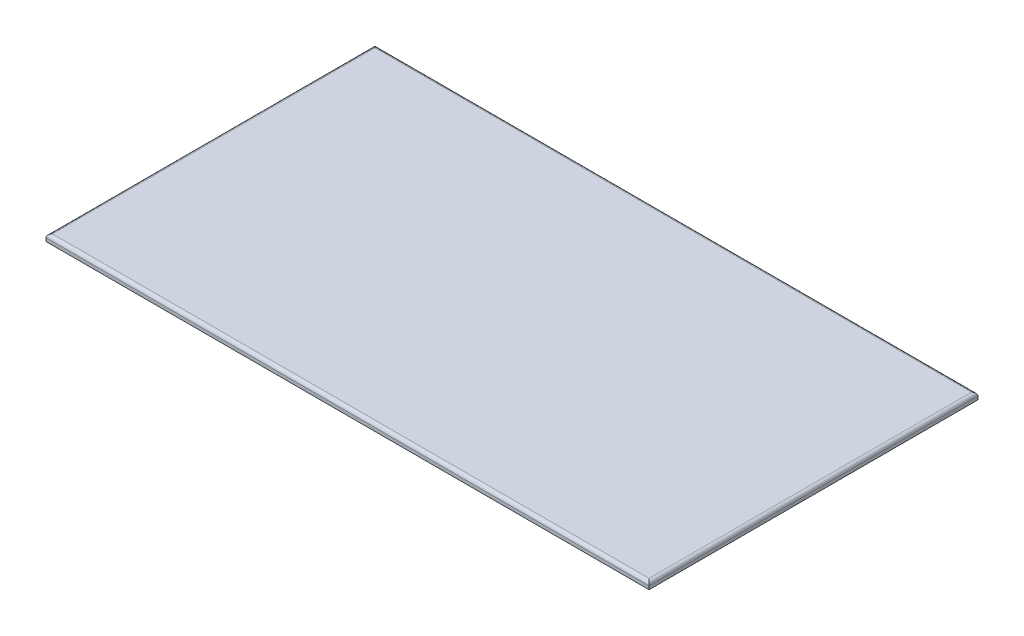
ISO-10303-21;
HEADER;
FILE_DESCRIPTION(('STEP AP214'),'2;1');
FILE_NAME('part.step','',(''),(''),'','','');
FILE_SCHEMA(('AUTOMOTIVE_DESIGN { 1 0 10303 214 1 1 1 1 }'));
ENDSEC;
DATA;
#1=APPLICATION_CONTEXT('core data for automotive mechanical design processes');
#2=APPLICATION_PROTOCOL_DEFINITION('international standard','automotive_design',2000,#1);
#3=PRODUCT_CONTEXT('',#1,'mechanical');
#4=PRODUCT('Part','Part','',(#3));
#5=PRODUCT_RELATED_PRODUCT_CATEGORY('part','',(#4));
#6=PRODUCT_DEFINITION_FORMATION('','',#4);
#7=PRODUCT_DEFINITION_CONTEXT('part definition',#1,'design');
#8=PRODUCT_DEFINITION('design','',#6,#7);
#9=PRODUCT_DEFINITION_SHAPE('','',#8);
#10=(LENGTH_UNIT() NAMED_UNIT(*) SI_UNIT(.MILLI.,.METRE.));
#11=(NAMED_UNIT(*) PLANE_ANGLE_UNIT() SI_UNIT($,.RADIAN.));
#12=(NAMED_UNIT(*) SI_UNIT($,.STERADIAN.) SOLID_ANGLE_UNIT());
#13=UNCERTAINTY_MEASURE_WITH_UNIT(LENGTH_MEASURE(1.E-05),#10,'distance_accuracy_value','');
#14=(GEOMETRIC_REPRESENTATION_CONTEXT(3) GLOBAL_UNCERTAINTY_ASSIGNED_CONTEXT((#13)) GLOBAL_UNIT_ASSIGNED_CONTEXT((#10,
#11,#12)) REPRESENTATION_CONTEXT('',''));
#15=CARTESIAN_POINT('',(0.,0.,0.));
#16=DIRECTION('',(0.,0.,1.));
#17=DIRECTION('',(1.,0.,0.));
#18=AXIS2_PLACEMENT_3D('',#15,#16,#17);
#19=CARTESIAN_POINT('',(0.,0.,0.));
#20=DIRECTION('',(0.,-1.,0.));
#21=DIRECTION('',(0.,0.,-1.));
#22=AXIS2_PLACEMENT_3D('',#19,#20,#21);
#23=PLANE('',#22);
#24=DIRECTION('',(0.,0.,1.));
#25=VECTOR('',#24,1.);
#26=CARTESIAN_POINT('',(0.,0.,0.));
#27=LINE('',#26,#25);
#28=CARTESIAN_POINT('',(0.,0.,-300.));
#29=VERTEX_POINT('',#28);
#30=CARTESIAN_POINT('',(0.,0.,0.));
#31=VERTEX_POINT('',#30);
#32=EDGE_CURVE('E175',#29,#31,#27,.T.);
#33=ORIENTED_EDGE('',*,*,#32,.F.);
#34=DIRECTION('',(-1.,0.,0.));
#35=VECTOR('',#34,1.);
#36=CARTESIAN_POINT('',(0.,0.,-300.));
#37=LINE('',#36,#35);
#38=CARTESIAN_POINT('',(550.,0.,-300.));
#39=VERTEX_POINT('',#38);
#40=EDGE_CURVE('E197',#39,#29,#37,.T.);
#41=ORIENTED_EDGE('',*,*,#40,.F.);
#42=DIRECTION('',(0.,0.,-1.));
#43=VECTOR('',#42,1.);
#44=CARTESIAN_POINT('',(550.,0.,0.));
#45=LINE('',#44,#43);
#46=CARTESIAN_POINT('',(550.,0.,0.));
#47=VERTEX_POINT('',#46);
#48=EDGE_CURVE('E177',#47,#39,#45,.T.);
#49=ORIENTED_EDGE('',*,*,#48,.F.);
#50=DIRECTION('',(1.,0.,0.));
#51=VECTOR('',#50,1.);
#52=CARTESIAN_POINT('',(0.,0.,0.));
#53=LINE('',#52,#51);
#54=EDGE_CURVE('E160',#31,#47,#53,.T.);
#55=ORIENTED_EDGE('',*,*,#54,.F.);
#56=EDGE_LOOP('',(#33,#41,#49,#55));
#57=FACE_BOUND('',#56,.T.);
#58=DIRECTION('',(0.,0.,1.));
#59=VECTOR('',#58,1.);
#60=CARTESIAN_POINT('',(525.,0.,0.));
#61=LINE('',#60,#59);
#62=CARTESIAN_POINT('',(525.,0.,-269.));
#63=VERTEX_POINT('',#62);
#64=CARTESIAN_POINT('',(525.,0.,-31.));
#65=VERTEX_POINT('',#64);
#66=EDGE_CURVE('E344',#63,#65,#61,.T.);
#67=ORIENTED_EDGE('',*,*,#66,.F.);
#68=CARTESIAN_POINT('',(519.,0.,-269.));
#69=DIRECTION('',(0.,-1.,0.));
#70=DIRECTION('',(0.,0.,-1.));
#71=AXIS2_PLACEMENT_3D('',#68,#69,#70);
#72=CIRCLE('',#71,6.);
#73=CARTESIAN_POINT('',(519.,0.,-275.));
#74=VERTEX_POINT('',#73);
#75=EDGE_CURVE('E51',#63,#74,#72,.F.);
#76=ORIENTED_EDGE('',*,*,#75,.T.);
#77=DIRECTION('',(1.,0.,0.));
#78=VECTOR('',#77,1.);
#79=CARTESIAN_POINT('',(0.,0.,-275.));
#80=LINE('',#79,#78);
#81=CARTESIAN_POINT('',(31.,0.,-275.));
#82=VERTEX_POINT('',#81);
#83=EDGE_CURVE('E341',#82,#74,#80,.T.);
#84=ORIENTED_EDGE('',*,*,#83,.F.);
#85=CARTESIAN_POINT('',(31.,0.,-269.));
#86=DIRECTION('',(0.,-1.,0.));
#87=DIRECTION('',(0.,0.,-1.));
#88=AXIS2_PLACEMENT_3D('',#85,#86,#87);
#89=CIRCLE('',#88,6.);
#90=CARTESIAN_POINT('',(25.,0.,-269.));
#91=VERTEX_POINT('',#90);
#92=EDGE_CURVE('E291',#82,#91,#89,.F.);
#93=ORIENTED_EDGE('',*,*,#92,.T.);
#94=DIRECTION('',(0.,0.,-1.));
#95=VECTOR('',#94,1.);
#96=CARTESIAN_POINT('',(25.,0.,0.));
#97=LINE('',#96,#95);
#98=CARTESIAN_POINT('',(25.,0.,-31.0000000000001));
#99=VERTEX_POINT('',#98);
#100=EDGE_CURVE('E192',#99,#91,#97,.T.);
#101=ORIENTED_EDGE('',*,*,#100,.F.);
#102=CARTESIAN_POINT('',(31.,0.,-31.0000000000001));
#103=DIRECTION('',(0.,-1.,0.));
#104=DIRECTION('',(0.,0.,-1.));
#105=AXIS2_PLACEMENT_3D('',#102,#103,#104);
#106=CIRCLE('',#105,6.);
#107=CARTESIAN_POINT('',(31.,0.,-25.0000000000001));
#108=VERTEX_POINT('',#107);
#109=EDGE_CURVE('E288',#99,#108,#106,.F.);
#110=ORIENTED_EDGE('',*,*,#109,.T.);
#111=DIRECTION('',(-1.,0.,0.));
#112=VECTOR('',#111,1.);
#113=CARTESIAN_POINT('',(0.,0.,-25.0000000000001));
#114=LINE('',#113,#112);
#115=CARTESIAN_POINT('',(519.,0.,-25.));
#116=VERTEX_POINT('',#115);
#117=EDGE_CURVE('E349',#116,#108,#114,.T.);
#118=ORIENTED_EDGE('',*,*,#117,.F.);
#119=CARTESIAN_POINT('',(519.,0.,-31.));
#120=DIRECTION('',(0.,-1.,0.));
#121=DIRECTION('',(0.,0.,-1.));
#122=AXIS2_PLACEMENT_3D('',#119,#120,#121);
#123=CIRCLE('',#122,6.);
#124=EDGE_CURVE('E11',#116,#65,#123,.F.);
#125=ORIENTED_EDGE('',*,*,#124,.T.);
#126=EDGE_LOOP('',(#67,#76,#84,#93,#101,#110,#118,#125));
#127=FACE_BOUND('',#126,.T.);
#128=ADVANCED_FACE('F41',(#57,#127),#23,.T.);
#129=CARTESIAN_POINT('',(0.,6.,0.));
#130=DIRECTION('',(1.,0.,0.));
#131=DIRECTION('',(0.,0.,-1.));
#132=AXIS2_PLACEMENT_3D('',#129,#130,#131);
#133=PLANE('',#132);
#134=DIRECTION('',(0.,-1.,0.));
#135=VECTOR('',#134,1.);
#136=CARTESIAN_POINT('',(0.,6.,0.));
#137=LINE('',#136,#135);
#138=CARTESIAN_POINT('',(0.,3.,0.));
#139=VERTEX_POINT('',#138);
#140=EDGE_CURVE('E156',#139,#31,#137,.T.);
#141=ORIENTED_EDGE('',*,*,#140,.F.);
#142=DIRECTION('',(0.,0.,1.));
#143=VECTOR('',#142,1.);
#144=CARTESIAN_POINT('',(0.,3.,0.));
#145=LINE('',#144,#143);
#146=CARTESIAN_POINT('',(0.,3.,-300.));
#147=VERTEX_POINT('',#146);
#148=EDGE_CURVE('E228',#139,#147,#145,.F.);
#149=ORIENTED_EDGE('',*,*,#148,.T.);
#150=DIRECTION('',(0.,-1.,0.));
#151=VECTOR('',#150,1.);
#152=CARTESIAN_POINT('',(0.,6.,-300.));
#153=LINE('',#152,#151);
#154=EDGE_CURVE('E182',#147,#29,#153,.T.);
#155=ORIENTED_EDGE('',*,*,#154,.T.);
#156=ORIENTED_EDGE('',*,*,#32,.T.);
#157=EDGE_LOOP('',(#141,#149,#155,#156));
#158=FACE_BOUND('',#157,.T.);
#159=ADVANCED_FACE('F180',(#158),#133,.F.);
#160=CARTESIAN_POINT('',(0.,6.,0.));
#161=DIRECTION('',(0.,0.,-1.));
#162=DIRECTION('',(-1.,0.,0.));
#163=AXIS2_PLACEMENT_3D('',#160,#161,#162);
#164=PLANE('',#163);
#165=DIRECTION('',(0.,-1.,0.));
#166=VECTOR('',#165,1.);
#167=CARTESIAN_POINT('',(550.,6.,0.));
#168=LINE('',#167,#166);
#169=CARTESIAN_POINT('',(550.,3.,0.));
#170=VERTEX_POINT('',#169);
#171=EDGE_CURVE('E169',#170,#47,#168,.T.);
#172=ORIENTED_EDGE('',*,*,#171,.F.);
#173=DIRECTION('',(1.,0.,0.));
#174=VECTOR('',#173,1.);
#175=CARTESIAN_POINT('',(0.,3.,0.));
#176=LINE('',#175,#174);
#177=EDGE_CURVE('E163',#170,#139,#176,.F.);
#178=ORIENTED_EDGE('',*,*,#177,.T.);
#179=ORIENTED_EDGE('',*,*,#140,.T.);
#180=ORIENTED_EDGE('',*,*,#54,.T.);
#181=EDGE_LOOP('',(#172,#178,#179,#180));
#182=FACE_BOUND('',#181,.T.);
#183=ADVANCED_FACE('F159',(#182),#164,.F.);
#184=CARTESIAN_POINT('',(550.,6.,0.));
#185=DIRECTION('',(-1.,0.,0.));
#186=DIRECTION('',(0.,0.,1.));
#187=AXIS2_PLACEMENT_3D('',#184,#185,#186);
#188=PLANE('',#187);
#189=DIRECTION('',(0.,-1.,0.));
#190=VECTOR('',#189,1.);
#191=CARTESIAN_POINT('',(550.,6.,-300.));
#192=LINE('',#191,#190);
#193=CARTESIAN_POINT('',(550.,3.,-300.));
#194=VERTEX_POINT('',#193);
#195=EDGE_CURVE('E202',#194,#39,#192,.T.);
#196=ORIENTED_EDGE('',*,*,#195,.F.);
#197=DIRECTION('',(0.,0.,-1.));
#198=VECTOR('',#197,1.);
#199=CARTESIAN_POINT('',(550.,3.,0.));
#200=LINE('',#199,#198);
#201=EDGE_CURVE('E223',#194,#170,#200,.F.);
#202=ORIENTED_EDGE('',*,*,#201,.T.);
#203=ORIENTED_EDGE('',*,*,#171,.T.);
#204=ORIENTED_EDGE('',*,*,#48,.T.);
#205=EDGE_LOOP('',(#196,#202,#203,#204));
#206=FACE_BOUND('',#205,.T.);
#207=ADVANCED_FACE('F432',(#206),#188,.F.);
#208=CARTESIAN_POINT('',(0.,6.,-300.));
#209=DIRECTION('',(0.,0.,1.));
#210=DIRECTION('',(1.,0.,0.));
#211=AXIS2_PLACEMENT_3D('',#208,#209,#210);
#212=PLANE('',#211);
#213=ORIENTED_EDGE('',*,*,#154,.F.);
#214=DIRECTION('',(-1.,0.,0.));
#215=VECTOR('',#214,1.);
#216=CARTESIAN_POINT('',(0.,3.,-300.));
#217=LINE('',#216,#215);
#218=EDGE_CURVE('E219',#147,#194,#217,.F.);
#219=ORIENTED_EDGE('',*,*,#218,.T.);
#220=ORIENTED_EDGE('',*,*,#195,.T.);
#221=ORIENTED_EDGE('',*,*,#40,.T.);
#222=EDGE_LOOP('',(#213,#219,#220,#221));
#223=FACE_BOUND('',#222,.T.);
#224=ADVANCED_FACE('F429',(#223),#212,.F.);
#225=CARTESIAN_POINT('',(0.,6.,0.));
#226=DIRECTION('',(0.,-1.,0.));
#227=DIRECTION('',(0.,0.,-1.));
#228=AXIS2_PLACEMENT_3D('',#225,#226,#227);
#229=PLANE('',#228);
#230=DIRECTION('',(0.,0.,-1.));
#231=VECTOR('',#230,1.);
#232=CARTESIAN_POINT('',(547.,6.,0.));
#233=LINE('',#232,#231);
#234=CARTESIAN_POINT('',(547.,6.,-3.));
#235=VERTEX_POINT('',#234);
#236=CARTESIAN_POINT('',(547.,6.,-297.));
#237=VERTEX_POINT('',#236);
#238=EDGE_CURVE('E212',#235,#237,#233,.T.);
#239=ORIENTED_EDGE('',*,*,#238,.T.);
#240=DIRECTION('',(-1.,0.,0.));
#241=VECTOR('',#240,1.);
#242=CARTESIAN_POINT('',(0.,6.,-297.));
#243=LINE('',#242,#241);
#244=CARTESIAN_POINT('',(3.,6.,-297.));
#245=VERTEX_POINT('',#244);
#246=EDGE_CURVE('E215',#237,#245,#243,.T.);
#247=ORIENTED_EDGE('',*,*,#246,.T.);
#248=DIRECTION('',(0.,0.,1.));
#249=VECTOR('',#248,1.);
#250=CARTESIAN_POINT('',(3.,6.,0.));
#251=LINE('',#250,#249);
#252=CARTESIAN_POINT('',(3.,6.,-3.));
#253=VERTEX_POINT('',#252);
#254=EDGE_CURVE('E168',#245,#253,#251,.T.);
#255=ORIENTED_EDGE('',*,*,#254,.T.);
#256=DIRECTION('',(1.,0.,0.));
#257=VECTOR('',#256,1.);
#258=CARTESIAN_POINT('',(0.,6.,-3.));
#259=LINE('',#258,#257);
#260=EDGE_CURVE('E209',#253,#235,#259,.T.);
#261=ORIENTED_EDGE('',*,*,#260,.T.);
#262=EDGE_LOOP('',(#239,#247,#255,#261));
#263=FACE_BOUND('',#262,.T.);
#264=ADVANCED_FACE('F427',(#263),#229,.F.);
#265=CARTESIAN_POINT('',(0.,3.,-3.));
#266=DIRECTION('',(1.,0.,0.));
#267=DIRECTION('',(0.,0.,-1.));
#268=AXIS2_PLACEMENT_3D('',#265,#266,#267);
#269=CYLINDRICAL_SURFACE('',#268,3.);
#270=CARTESIAN_POINT('',(3.,3.,-3.));
#271=DIRECTION('',(0.707106781186547,0.,0.707106781186547));
#272=DIRECTION('',(-0.707106781186547,0.,0.707106781186547));
#273=AXIS2_PLACEMENT_3D('',#270,#271,#272);
#274=ELLIPSE('',#273,4.24264068711928,3.);
#275=EDGE_CURVE('E189',#139,#253,#274,.F.);
#276=ORIENTED_EDGE('',*,*,#275,.F.);
#277=ORIENTED_EDGE('',*,*,#177,.F.);
#278=CARTESIAN_POINT('',(547.,3.,-3.));
#279=DIRECTION('',(0.707106781186547,0.,-0.707106781186547));
#280=DIRECTION('',(0.707106781186547,0.,0.707106781186547));
#281=AXIS2_PLACEMENT_3D('',#278,#279,#280);
#282=ELLIPSE('',#281,4.24264068711928,3.);
#283=EDGE_CURVE('E185',#235,#170,#282,.T.);
#284=ORIENTED_EDGE('',*,*,#283,.F.);
#285=ORIENTED_EDGE('',*,*,#260,.F.);
#286=EDGE_LOOP('',(#276,#277,#284,#285));
#287=FACE_BOUND('',#286,.T.);
#288=ADVANCED_FACE('F451',(#287),#269,.T.);
#289=CARTESIAN_POINT('',(547.,3.,0.));
#290=DIRECTION('',(0.,0.,-1.));
#291=DIRECTION('',(-1.,0.,0.));
#292=AXIS2_PLACEMENT_3D('',#289,#290,#291);
#293=CYLINDRICAL_SURFACE('',#292,3.);
#294=ORIENTED_EDGE('',*,*,#283,.T.);
#295=ORIENTED_EDGE('',*,*,#201,.F.);
#296=CARTESIAN_POINT('',(547.,3.,-297.));
#297=DIRECTION('',(-0.707106781186547,0.,-0.707106781186547));
#298=DIRECTION('',(0.707106781186547,0.,-0.707106781186547));
#299=AXIS2_PLACEMENT_3D('',#296,#297,#298);
#300=ELLIPSE('',#299,4.24264068711928,3.);
#301=EDGE_CURVE('E235',#237,#194,#300,.T.);
#302=ORIENTED_EDGE('',*,*,#301,.F.);
#303=ORIENTED_EDGE('',*,*,#238,.F.);
#304=EDGE_LOOP('',(#294,#295,#302,#303));
#305=FACE_BOUND('',#304,.T.);
#306=ADVANCED_FACE('F447',(#305),#293,.T.);
#307=CARTESIAN_POINT('',(3.,3.,0.));
#308=DIRECTION('',(0.,0.,1.));
#309=DIRECTION('',(1.,0.,0.));
#310=AXIS2_PLACEMENT_3D('',#307,#308,#309);
#311=CYLINDRICAL_SURFACE('',#310,3.);
#312=ORIENTED_EDGE('',*,*,#275,.T.);
#313=ORIENTED_EDGE('',*,*,#254,.F.);
#314=CARTESIAN_POINT('',(3.,3.,-297.));
#315=DIRECTION('',(-0.707106781186547,0.,0.707106781186547));
#316=DIRECTION('',(0.707106781186547,0.,0.707106781186547));
#317=AXIS2_PLACEMENT_3D('',#314,#315,#316);
#318=ELLIPSE('',#317,4.24264068711928,3.);
#319=EDGE_CURVE('E232',#147,#245,#318,.F.);
#320=ORIENTED_EDGE('',*,*,#319,.F.);
#321=ORIENTED_EDGE('',*,*,#148,.F.);
#322=EDGE_LOOP('',(#312,#313,#320,#321));
#323=FACE_BOUND('',#322,.T.);
#324=ADVANCED_FACE('F443',(#323),#311,.T.);
#325=CARTESIAN_POINT('',(0.,3.,-297.));
#326=DIRECTION('',(-1.,0.,0.));
#327=DIRECTION('',(0.,0.,1.));
#328=AXIS2_PLACEMENT_3D('',#325,#326,#327);
#329=CYLINDRICAL_SURFACE('',#328,3.);
#330=ORIENTED_EDGE('',*,*,#301,.T.);
#331=ORIENTED_EDGE('',*,*,#218,.F.);
#332=ORIENTED_EDGE('',*,*,#319,.T.);
#333=ORIENTED_EDGE('',*,*,#246,.F.);
#334=EDGE_LOOP('',(#330,#331,#332,#333));
#335=FACE_BOUND('',#334,.T.);
#336=ADVANCED_FACE('F439',(#335),#329,.T.);
#337=CARTESIAN_POINT('',(0.,-26.,-275.));
#338=DIRECTION('',(0.,0.,1.));
#339=DIRECTION('',(1.,0.,0.));
#340=AXIS2_PLACEMENT_3D('',#337,#338,#339);
#341=PLANE('',#340);
#342=DIRECTION('',(1.,0.,0.));
#343=VECTOR('',#342,1.);
#344=CARTESIAN_POINT('',(25.,-20.,-275.));
#345=LINE('',#344,#343);
#346=CARTESIAN_POINT('',(519.,-20.,-275.));
#347=VERTEX_POINT('',#346);
#348=CARTESIAN_POINT('',(31.,-20.,-275.));
#349=VERTEX_POINT('',#348);
#350=EDGE_CURVE('E59',#347,#349,#345,.F.);
#351=ORIENTED_EDGE('',*,*,#350,.T.);
#352=DIRECTION('',(0.,1.,0.));
#353=VECTOR('',#352,1.);
#354=CARTESIAN_POINT('',(31.,-26.,-275.));
#355=LINE('',#354,#353);
#356=EDGE_CURVE('E285',#349,#82,#355,.T.);
#357=ORIENTED_EDGE('',*,*,#356,.T.);
#358=ORIENTED_EDGE('',*,*,#83,.T.);
#359=DIRECTION('',(0.,1.,0.));
#360=VECTOR('',#359,1.);
#361=CARTESIAN_POINT('',(519.,-26.,-275.));
#362=LINE('',#361,#360);
#363=EDGE_CURVE('E64',#74,#347,#362,.F.);
#364=ORIENTED_EDGE('',*,*,#363,.T.);
#365=EDGE_LOOP('',(#351,#357,#358,#364));
#366=FACE_BOUND('',#365,.T.);
#367=ADVANCED_FACE('F442',(#366),#341,.F.);
#368=CARTESIAN_POINT('',(525.,-26.,0.));
#369=DIRECTION('',(-1.,0.,0.));
#370=DIRECTION('',(0.,0.,1.));
#371=AXIS2_PLACEMENT_3D('',#368,#369,#370);
#372=PLANE('',#371);
#373=DIRECTION('',(0.,0.,1.));
#374=VECTOR('',#373,1.);
#375=CARTESIAN_POINT('',(525.,-20.,-275.));
#376=LINE('',#375,#374);
#377=CARTESIAN_POINT('',(525.,-20.,-31.));
#378=VERTEX_POINT('',#377);
#379=CARTESIAN_POINT('',(525.,-20.,-269.));
#380=VERTEX_POINT('',#379);
#381=EDGE_CURVE('E275',#378,#380,#376,.F.);
#382=ORIENTED_EDGE('',*,*,#381,.T.);
#383=DIRECTION('',(0.,1.,0.));
#384=VECTOR('',#383,1.);
#385=CARTESIAN_POINT('',(525.,-26.,-269.));
#386=LINE('',#385,#384);
#387=EDGE_CURVE('E278',#380,#63,#386,.T.);
#388=ORIENTED_EDGE('',*,*,#387,.T.);
#389=ORIENTED_EDGE('',*,*,#66,.T.);
#390=DIRECTION('',(0.,1.,0.));
#391=VECTOR('',#390,1.);
#392=CARTESIAN_POINT('',(525.,-26.,-31.));
#393=LINE('',#392,#391);
#394=EDGE_CURVE('E272',#65,#378,#393,.F.);
#395=ORIENTED_EDGE('',*,*,#394,.T.);
#396=EDGE_LOOP('',(#382,#388,#389,#395));
#397=FACE_BOUND('',#396,.T.);
#398=ADVANCED_FACE('F401',(#397),#372,.F.);
#399=CARTESIAN_POINT('',(0.,-26.,-25.0000000000001));
#400=DIRECTION('',(0.,0.,-1.));
#401=DIRECTION('',(-1.,0.,0.));
#402=AXIS2_PLACEMENT_3D('',#399,#400,#401);
#403=PLANE('',#402);
#404=ORIENTED_EDGE('',*,*,#117,.T.);
#405=DIRECTION('',(0.,1.,0.));
#406=VECTOR('',#405,1.);
#407=CARTESIAN_POINT('',(31.,-26.,-25.0000000000001));
#408=LINE('',#407,#406);
#409=CARTESIAN_POINT('',(31.,-20.,-25.0000000000001));
#410=VERTEX_POINT('',#409);
#411=EDGE_CURVE('E269',#108,#410,#408,.F.);
#412=ORIENTED_EDGE('',*,*,#411,.T.);
#413=DIRECTION('',(-1.,0.,0.));
#414=VECTOR('',#413,1.);
#415=CARTESIAN_POINT('',(525.,-20.,-25.));
#416=LINE('',#415,#414);
#417=CARTESIAN_POINT('',(519.,-20.,-25.));
#418=VERTEX_POINT('',#417);
#419=EDGE_CURVE('E266',#410,#418,#416,.F.);
#420=ORIENTED_EDGE('',*,*,#419,.T.);
#421=DIRECTION('',(0.,1.,0.));
#422=VECTOR('',#421,1.);
#423=CARTESIAN_POINT('',(519.,-26.,-25.));
#424=LINE('',#423,#422);
#425=EDGE_CURVE('E263',#418,#116,#424,.T.);
#426=ORIENTED_EDGE('',*,*,#425,.T.);
#427=EDGE_LOOP('',(#404,#412,#420,#426));
#428=FACE_BOUND('',#427,.T.);
#429=ADVANCED_FACE('F553',(#428),#403,.F.);
#430=CARTESIAN_POINT('',(25.,-26.,0.));
#431=DIRECTION('',(1.,0.,0.));
#432=DIRECTION('',(0.,0.,-1.));
#433=AXIS2_PLACEMENT_3D('',#430,#431,#432);
#434=PLANE('',#433);
#435=DIRECTION('',(0.,0.,-1.));
#436=VECTOR('',#435,1.);
#437=CARTESIAN_POINT('',(25.,-20.,-25.0000000000001));
#438=LINE('',#437,#436);
#439=CARTESIAN_POINT('',(25.,-20.,-269.));
#440=VERTEX_POINT('',#439);
#441=CARTESIAN_POINT('',(25.,-20.,-31.0000000000001));
#442=VERTEX_POINT('',#441);
#443=EDGE_CURVE('E256',#440,#442,#438,.F.);
#444=ORIENTED_EDGE('',*,*,#443,.T.);
#445=DIRECTION('',(0.,1.,0.));
#446=VECTOR('',#445,1.);
#447=CARTESIAN_POINT('',(25.,-26.,-31.0000000000001));
#448=LINE('',#447,#446);
#449=EDGE_CURVE('E260',#442,#99,#448,.T.);
#450=ORIENTED_EDGE('',*,*,#449,.T.);
#451=ORIENTED_EDGE('',*,*,#100,.T.);
#452=DIRECTION('',(0.,1.,0.));
#453=VECTOR('',#452,1.);
#454=CARTESIAN_POINT('',(25.,-26.,-269.));
#455=LINE('',#454,#453);
#456=EDGE_CURVE('E253',#91,#440,#455,.F.);
#457=ORIENTED_EDGE('',*,*,#456,.T.);
#458=EDGE_LOOP('',(#444,#450,#451,#457));
#459=FACE_BOUND('',#458,.T.);
#460=ADVANCED_FACE('F361',(#459),#434,.F.);
#461=CARTESIAN_POINT('',(0.,-26.,0.));
#462=DIRECTION('',(0.,-1.,0.));
#463=DIRECTION('',(0.,0.,-1.));
#464=AXIS2_PLACEMENT_3D('',#461,#462,#463);
#465=PLANE('',#464);
#466=DIRECTION('',(-1.,0.,0.));
#467=VECTOR('',#466,1.);
#468=CARTESIAN_POINT('',(25.,-26.,-31.0000000000001));
#469=LINE('',#468,#467);
#470=CARTESIAN_POINT('',(519.,-26.,-31.));
#471=VERTEX_POINT('',#470);
#472=CARTESIAN_POINT('',(31.,-26.,-31.0000000000001));
#473=VERTEX_POINT('',#472);
#474=EDGE_CURVE('E246',#471,#473,#469,.T.);
#475=ORIENTED_EDGE('',*,*,#474,.T.);
#476=DIRECTION('',(0.,0.,-1.));
#477=VECTOR('',#476,1.);
#478=CARTESIAN_POINT('',(31.,-26.,-275.));
#479=LINE('',#478,#477);
#480=CARTESIAN_POINT('',(31.,-26.,-269.));
#481=VERTEX_POINT('',#480);
#482=EDGE_CURVE('E249',#473,#481,#479,.T.);
#483=ORIENTED_EDGE('',*,*,#482,.T.);
#484=DIRECTION('',(1.,0.,0.));
#485=VECTOR('',#484,1.);
#486=CARTESIAN_POINT('',(525.,-26.,-269.));
#487=LINE('',#486,#485);
#488=CARTESIAN_POINT('',(519.,-26.,-269.));
#489=VERTEX_POINT('',#488);
#490=EDGE_CURVE('E231',#481,#489,#487,.T.);
#491=ORIENTED_EDGE('',*,*,#490,.T.);
#492=DIRECTION('',(0.,0.,1.));
#493=VECTOR('',#492,1.);
#494=CARTESIAN_POINT('',(519.,-26.,-25.));
#495=LINE('',#494,#493);
#496=EDGE_CURVE('E243',#489,#471,#495,.T.);
#497=ORIENTED_EDGE('',*,*,#496,.T.);
#498=EDGE_LOOP('',(#475,#483,#491,#497));
#499=FACE_BOUND('',#498,.T.);
#500=ADVANCED_FACE('F383',(#499),#465,.T.);
#501=CARTESIAN_POINT('',(519.,-26.,-31.));
#502=DIRECTION('',(0.,1.,0.));
#503=DIRECTION('',(0.,0.,1.));
#504=AXIS2_PLACEMENT_3D('',#501,#502,#503);
#505=CYLINDRICAL_SURFACE('',#504,6.);
#506=ORIENTED_EDGE('',*,*,#124,.F.);
#507=ORIENTED_EDGE('',*,*,#425,.F.);
#508=CARTESIAN_POINT('',(519.,-20.,-31.));
#509=DIRECTION('',(0.,-1.,0.));
#510=DIRECTION('',(0.,0.,-1.));
#511=AXIS2_PLACEMENT_3D('',#508,#509,#510);
#512=CIRCLE('',#511,6.);
#513=EDGE_CURVE('E45',#378,#418,#512,.T.);
#514=ORIENTED_EDGE('',*,*,#513,.F.);
#515=ORIENTED_EDGE('',*,*,#394,.F.);
#516=EDGE_LOOP('',(#506,#507,#514,#515));
#517=FACE_BOUND('',#516,.T.);
#518=ADVANCED_FACE('F43',(#517),#505,.T.);
#519=CARTESIAN_POINT('',(519.,-20.,0.));
#520=DIRECTION('',(0.,0.,-1.));
#521=DIRECTION('',(-1.,0.,0.));
#522=AXIS2_PLACEMENT_3D('',#519,#520,#521);
#523=CYLINDRICAL_SURFACE('',#522,6.);
#524=CARTESIAN_POINT('',(519.,-20.,-269.));
#525=DIRECTION('',(0.,0.,-1.));
#526=DIRECTION('',(-1.,0.,0.));
#527=AXIS2_PLACEMENT_3D('',#524,#525,#526);
#528=CIRCLE('',#527,6.);
#529=EDGE_CURVE('E330',#380,#489,#528,.T.);
#530=ORIENTED_EDGE('',*,*,#529,.F.);
#531=ORIENTED_EDGE('',*,*,#381,.F.);
#532=CARTESIAN_POINT('',(519.,-20.,-31.));
#533=DIRECTION('',(0.,0.,1.));
#534=DIRECTION('',(1.,0.,0.));
#535=AXIS2_PLACEMENT_3D('',#532,#533,#534);
#536=CIRCLE('',#535,6.);
#537=EDGE_CURVE('E333',#471,#378,#536,.T.);
#538=ORIENTED_EDGE('',*,*,#537,.F.);
#539=ORIENTED_EDGE('',*,*,#496,.F.);
#540=EDGE_LOOP('',(#530,#531,#538,#539));
#541=FACE_BOUND('',#540,.T.);
#542=ADVANCED_FACE('F405',(#541),#523,.T.);
#543=CARTESIAN_POINT('',(519.,-26.,-269.));
#544=DIRECTION('',(0.,1.,0.));
#545=DIRECTION('',(0.,0.,1.));
#546=AXIS2_PLACEMENT_3D('',#543,#544,#545);
#547=CYLINDRICAL_SURFACE('',#546,6.);
#548=ORIENTED_EDGE('',*,*,#75,.F.);
#549=ORIENTED_EDGE('',*,*,#387,.F.);
#550=CARTESIAN_POINT('',(519.,-20.,-269.));
#551=DIRECTION('',(0.,-1.,0.));
#552=DIRECTION('',(0.,0.,-1.));
#553=AXIS2_PLACEMENT_3D('',#550,#551,#552);
#554=CIRCLE('',#553,6.);
#555=EDGE_CURVE('E326',#347,#380,#554,.T.);
#556=ORIENTED_EDGE('',*,*,#555,.F.);
#557=ORIENTED_EDGE('',*,*,#363,.F.);
#558=EDGE_LOOP('',(#548,#549,#556,#557));
#559=FACE_BOUND('',#558,.T.);
#560=ADVANCED_FACE('F410',(#559),#547,.T.);
#561=CARTESIAN_POINT('',(519.,-20.,-31.));
#562=DIRECTION('',(0.,0.,1.));
#563=DIRECTION('',(1.,0.,0.));
#564=AXIS2_PLACEMENT_3D('',#561,#562,#563);
#565=SPHERICAL_SURFACE('',#564,6.);
#566=ORIENTED_EDGE('',*,*,#537,.T.);
#567=ORIENTED_EDGE('',*,*,#513,.T.);
#568=CARTESIAN_POINT('',(519.,-20.,-31.));
#569=DIRECTION('',(1.,0.,0.));
#570=DIRECTION('',(0.,0.,-1.));
#571=AXIS2_PLACEMENT_3D('',#568,#569,#570);
#572=CIRCLE('',#571,6.);
#573=EDGE_CURVE('E322',#471,#418,#572,.F.);
#574=ORIENTED_EDGE('',*,*,#573,.F.);
#575=EDGE_LOOP('',(#566,#567,#574));
#576=FACE_BOUND('',#575,.T.);
#577=ADVANCED_FACE('F412',(#576),#565,.T.);
#578=CARTESIAN_POINT('',(519.,-20.,-269.));
#579=DIRECTION('',(0.,0.,1.));
#580=DIRECTION('',(1.,0.,0.));
#581=AXIS2_PLACEMENT_3D('',#578,#579,#580);
#582=SPHERICAL_SURFACE('',#581,6.);
#583=ORIENTED_EDGE('',*,*,#555,.T.);
#584=ORIENTED_EDGE('',*,*,#529,.T.);
#585=CARTESIAN_POINT('',(519.,-20.,-269.));
#586=DIRECTION('',(1.,0.,0.));
#587=DIRECTION('',(0.,0.,-1.));
#588=AXIS2_PLACEMENT_3D('',#585,#586,#587);
#589=CIRCLE('',#588,6.);
#590=EDGE_CURVE('E318',#347,#489,#589,.F.);
#591=ORIENTED_EDGE('',*,*,#590,.F.);
#592=EDGE_LOOP('',(#583,#584,#591));
#593=FACE_BOUND('',#592,.T.);
#594=ADVANCED_FACE('F407',(#593),#582,.T.);
#595=CARTESIAN_POINT('',(31.,-26.,-31.0000000000001));
#596=DIRECTION('',(0.,1.,0.));
#597=DIRECTION('',(0.,0.,1.));
#598=AXIS2_PLACEMENT_3D('',#595,#596,#597);
#599=CYLINDRICAL_SURFACE('',#598,6.);
#600=ORIENTED_EDGE('',*,*,#109,.F.);
#601=ORIENTED_EDGE('',*,*,#449,.F.);
#602=CARTESIAN_POINT('',(31.,-20.,-31.0000000000001));
#603=DIRECTION('',(0.,-1.,0.));
#604=DIRECTION('',(0.,0.,-1.));
#605=AXIS2_PLACEMENT_3D('',#602,#603,#604);
#606=CIRCLE('',#605,6.);
#607=EDGE_CURVE('E314',#410,#442,#606,.T.);
#608=ORIENTED_EDGE('',*,*,#607,.F.);
#609=ORIENTED_EDGE('',*,*,#411,.F.);
#610=EDGE_LOOP('',(#600,#601,#608,#609));
#611=FACE_BOUND('',#610,.T.);
#612=ADVANCED_FACE('F393',(#611),#599,.T.);
#613=CARTESIAN_POINT('',(0.,-20.,-31.0000000000001));
#614=DIRECTION('',(1.,0.,0.));
#615=DIRECTION('',(0.,0.,-1.));
#616=AXIS2_PLACEMENT_3D('',#613,#614,#615);
#617=CYLINDRICAL_SURFACE('',#616,6.);
#618=ORIENTED_EDGE('',*,*,#573,.T.);
#619=ORIENTED_EDGE('',*,*,#419,.F.);
#620=CARTESIAN_POINT('',(31.,-20.,-31.0000000000001));
#621=DIRECTION('',(-1.,0.,0.));
#622=DIRECTION('',(0.,0.,1.));
#623=AXIS2_PLACEMENT_3D('',#620,#621,#622);
#624=CIRCLE('',#623,6.);
#625=EDGE_CURVE('E310',#473,#410,#624,.T.);
#626=ORIENTED_EDGE('',*,*,#625,.F.);
#627=ORIENTED_EDGE('',*,*,#474,.F.);
#628=EDGE_LOOP('',(#618,#619,#626,#627));
#629=FACE_BOUND('',#628,.T.);
#630=ADVANCED_FACE('F388',(#629),#617,.T.);
#631=CARTESIAN_POINT('',(0.,-20.,-269.));
#632=DIRECTION('',(-1.,0.,0.));
#633=DIRECTION('',(0.,0.,1.));
#634=AXIS2_PLACEMENT_3D('',#631,#632,#633);
#635=CYLINDRICAL_SURFACE('',#634,6.);
#636=ORIENTED_EDGE('',*,*,#590,.T.);
#637=ORIENTED_EDGE('',*,*,#490,.F.);
#638=CARTESIAN_POINT('',(31.,-20.,-269.));
#639=DIRECTION('',(-1.,0.,0.));
#640=DIRECTION('',(0.,0.,1.));
#641=AXIS2_PLACEMENT_3D('',#638,#639,#640);
#642=CIRCLE('',#641,6.);
#643=EDGE_CURVE('E306',#349,#481,#642,.T.);
#644=ORIENTED_EDGE('',*,*,#643,.F.);
#645=ORIENTED_EDGE('',*,*,#350,.F.);
#646=EDGE_LOOP('',(#636,#637,#644,#645));
#647=FACE_BOUND('',#646,.T.);
#648=ADVANCED_FACE('F379',(#647),#635,.T.);
#649=CARTESIAN_POINT('',(31.,-26.,-269.));
#650=DIRECTION('',(0.,1.,0.));
#651=DIRECTION('',(0.,0.,1.));
#652=AXIS2_PLACEMENT_3D('',#649,#650,#651);
#653=CYLINDRICAL_SURFACE('',#652,6.);
#654=ORIENTED_EDGE('',*,*,#92,.F.);
#655=ORIENTED_EDGE('',*,*,#356,.F.);
#656=CARTESIAN_POINT('',(31.,-20.,-269.));
#657=DIRECTION('',(0.,-1.,0.));
#658=DIRECTION('',(0.,0.,-1.));
#659=AXIS2_PLACEMENT_3D('',#656,#657,#658);
#660=CIRCLE('',#659,6.);
#661=EDGE_CURVE('E302',#440,#349,#660,.T.);
#662=ORIENTED_EDGE('',*,*,#661,.F.);
#663=ORIENTED_EDGE('',*,*,#456,.F.);
#664=EDGE_LOOP('',(#654,#655,#662,#663));
#665=FACE_BOUND('',#664,.T.);
#666=ADVANCED_FACE('F367',(#665),#653,.T.);
#667=CARTESIAN_POINT('',(31.,-20.,-31.0000000000001));
#668=DIRECTION('',(0.,0.,1.));
#669=DIRECTION('',(1.,0.,0.));
#670=AXIS2_PLACEMENT_3D('',#667,#668,#669);
#671=SPHERICAL_SURFACE('',#670,6.);
#672=ORIENTED_EDGE('',*,*,#625,.T.);
#673=ORIENTED_EDGE('',*,*,#607,.T.);
#674=CARTESIAN_POINT('',(31.,-20.,-31.0000000000001));
#675=DIRECTION('',(0.,0.,1.));
#676=DIRECTION('',(1.,0.,0.));
#677=AXIS2_PLACEMENT_3D('',#674,#675,#676);
#678=CIRCLE('',#677,6.);
#679=EDGE_CURVE('E299',#473,#442,#678,.F.);
#680=ORIENTED_EDGE('',*,*,#679,.F.);
#681=EDGE_LOOP('',(#672,#673,#680));
#682=FACE_BOUND('',#681,.T.);
#683=ADVANCED_FACE('F391',(#682),#671,.T.);
#684=CARTESIAN_POINT('',(31.,-20.,-269.));
#685=DIRECTION('',(0.,0.,1.));
#686=DIRECTION('',(1.,0.,0.));
#687=AXIS2_PLACEMENT_3D('',#684,#685,#686);
#688=SPHERICAL_SURFACE('',#687,6.);
#689=ORIENTED_EDGE('',*,*,#661,.T.);
#690=ORIENTED_EDGE('',*,*,#643,.T.);
#691=CARTESIAN_POINT('',(31.,-20.,-269.));
#692=DIRECTION('',(0.,0.,-1.));
#693=DIRECTION('',(-1.,0.,0.));
#694=AXIS2_PLACEMENT_3D('',#691,#692,#693);
#695=CIRCLE('',#694,6.);
#696=EDGE_CURVE('E296',#440,#481,#695,.F.);
#697=ORIENTED_EDGE('',*,*,#696,.F.);
#698=EDGE_LOOP('',(#689,#690,#697));
#699=FACE_BOUND('',#698,.T.);
#700=ADVANCED_FACE('F376',(#699),#688,.T.);
#701=CARTESIAN_POINT('',(31.,-20.,0.));
#702=DIRECTION('',(0.,0.,1.));
#703=DIRECTION('',(1.,0.,0.));
#704=AXIS2_PLACEMENT_3D('',#701,#702,#703);
#705=CYLINDRICAL_SURFACE('',#704,6.);
#706=ORIENTED_EDGE('',*,*,#679,.T.);
#707=ORIENTED_EDGE('',*,*,#443,.F.);
#708=ORIENTED_EDGE('',*,*,#696,.T.);
#709=ORIENTED_EDGE('',*,*,#482,.F.);
#710=EDGE_LOOP('',(#706,#707,#708,#709));
#711=FACE_BOUND('',#710,.T.);
#712=ADVANCED_FACE('F373',(#711),#705,.T.);
#713=CLOSED_SHELL('',(#128,#159,#183,#207,#224,#264,#288,#306,#324,#336,#367,#398,#429,#460,
#500,#518,#542,#560,#577,#594,#612,#630,#648,#666,#683,#700,#712));
#714=MANIFOLD_SOLID_BREP('B2',#713);
#715=ADVANCED_BREP_SHAPE_REPRESENTATION('',(#18,#714),#14);
#716=SHAPE_DEFINITION_REPRESENTATION(#9,#715);
ENDSEC;
END-ISO-10303-21;
